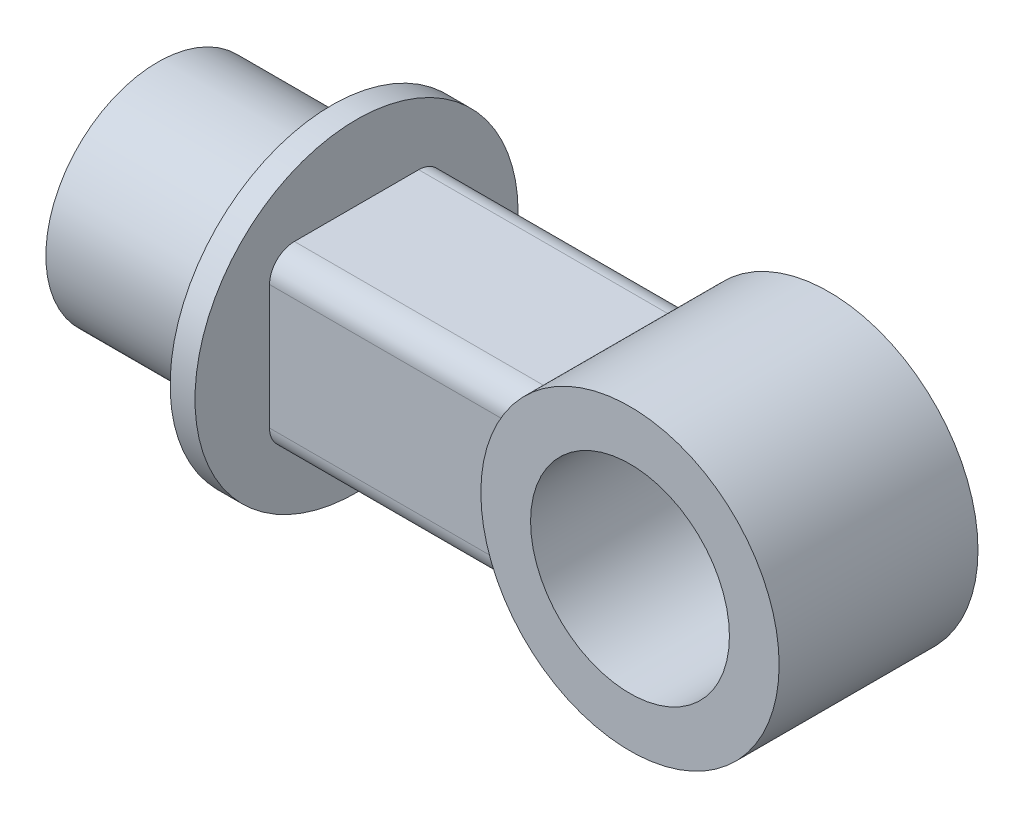
ISO-10303-21;
HEADER;
FILE_DESCRIPTION(('STEP AP214'),'2;1');
FILE_NAME('part.step','',(''),(''),'','','');
FILE_SCHEMA(('AUTOMOTIVE_DESIGN { 1 0 10303 214 1 1 1 1 }'));
ENDSEC;
DATA;
#1=APPLICATION_CONTEXT('core data for automotive mechanical design processes');
#2=APPLICATION_PROTOCOL_DEFINITION('international standard','automotive_design',2000,#1);
#3=PRODUCT_CONTEXT('',#1,'mechanical');
#4=PRODUCT('Part','Part','',(#3));
#5=PRODUCT_RELATED_PRODUCT_CATEGORY('part','',(#4));
#6=PRODUCT_DEFINITION_FORMATION('','',#4);
#7=PRODUCT_DEFINITION_CONTEXT('part definition',#1,'design');
#8=PRODUCT_DEFINITION('design','',#6,#7);
#9=PRODUCT_DEFINITION_SHAPE('','',#8);
#10=(LENGTH_UNIT() NAMED_UNIT(*) SI_UNIT(.MILLI.,.METRE.));
#11=(NAMED_UNIT(*) PLANE_ANGLE_UNIT() SI_UNIT($,.RADIAN.));
#12=(NAMED_UNIT(*) SI_UNIT($,.STERADIAN.) SOLID_ANGLE_UNIT());
#13=UNCERTAINTY_MEASURE_WITH_UNIT(LENGTH_MEASURE(1.E-05),#10,'distance_accuracy_value','');
#14=(GEOMETRIC_REPRESENTATION_CONTEXT(3) GLOBAL_UNCERTAINTY_ASSIGNED_CONTEXT((#13)) GLOBAL_UNIT_ASSIGNED_CONTEXT((#10,
#11,#12)) REPRESENTATION_CONTEXT('',''));
#15=CARTESIAN_POINT('',(0.,0.,0.));
#16=DIRECTION('',(0.,0.,1.));
#17=DIRECTION('',(1.,0.,0.));
#18=AXIS2_PLACEMENT_3D('',#15,#16,#17);
#19=CARTESIAN_POINT('',(190.,35.,35.));
#20=DIRECTION('',(0.,-1.,0.));
#21=DIRECTION('',(0.,0.,-1.));
#22=AXIS2_PLACEMENT_3D('',#19,#20,#21);
#23=PLANE('',#22);
#24=DIRECTION('',(0.,0.,1.));
#25=VECTOR('',#24,1.);
#26=CARTESIAN_POINT('',(80.,35.,35.));
#27=LINE('',#26,#25);
#28=CARTESIAN_POINT('',(80.,35.,-25.));
#29=VERTEX_POINT('',#28);
#30=CARTESIAN_POINT('',(80.,35.,25.));
#31=VERTEX_POINT('',#30);
#32=EDGE_CURVE('E208',#29,#31,#27,.T.);
#33=ORIENTED_EDGE('',*,*,#32,.T.);
#34=DIRECTION('',(-1.,0.,0.));
#35=VECTOR('',#34,1.);
#36=CARTESIAN_POINT('',(190.,35.,25.));
#37=LINE('',#36,#35);
#38=CARTESIAN_POINT('',(181.266028275955,35.,25.));
#39=VERTEX_POINT('',#38);
#40=EDGE_CURVE('E160',#31,#39,#37,.F.);
#41=ORIENTED_EDGE('',*,*,#40,.T.);
#42=DIRECTION('',(0.,0.,-1.));
#43=VECTOR('',#42,1.);
#44=CARTESIAN_POINT('',(181.266028275955,35.,40.));
#45=LINE('',#44,#43);
#46=CARTESIAN_POINT('',(181.266028275955,35.,-25.));
#47=VERTEX_POINT('',#46);
#48=EDGE_CURVE('E220',#47,#39,#45,.F.);
#49=ORIENTED_EDGE('',*,*,#48,.F.);
#50=DIRECTION('',(-1.,0.,0.));
#51=VECTOR('',#50,1.);
#52=CARTESIAN_POINT('',(190.,35.,-25.));
#53=LINE('',#52,#51);
#54=EDGE_CURVE('E157',#47,#29,#53,.T.);
#55=ORIENTED_EDGE('',*,*,#54,.T.);
#56=EDGE_LOOP('',(#33,#41,#49,#55));
#57=FACE_BOUND('',#56,.T.);
#58=ADVANCED_FACE('F39',(#57),#23,.F.);
#59=CARTESIAN_POINT('',(190.,-35.,35.));
#60=DIRECTION('',(0.,1.,0.));
#61=DIRECTION('',(0.,0.,1.));
#62=AXIS2_PLACEMENT_3D('',#59,#60,#61);
#63=PLANE('',#62);
#64=DIRECTION('',(0.,0.,-1.));
#65=VECTOR('',#64,1.);
#66=CARTESIAN_POINT('',(181.266028275955,-35.,40.));
#67=LINE('',#66,#65);
#68=CARTESIAN_POINT('',(181.266028275955,-35.,25.));
#69=VERTEX_POINT('',#68);
#70=CARTESIAN_POINT('',(181.266028275955,-35.,-25.));
#71=VERTEX_POINT('',#70);
#72=EDGE_CURVE('E115',#69,#71,#67,.T.);
#73=ORIENTED_EDGE('',*,*,#72,.F.);
#74=DIRECTION('',(-1.,0.,0.));
#75=VECTOR('',#74,1.);
#76=CARTESIAN_POINT('',(190.,-35.,25.));
#77=LINE('',#76,#75);
#78=CARTESIAN_POINT('',(80.,-35.,25.));
#79=VERTEX_POINT('',#78);
#80=EDGE_CURVE('E130',#69,#79,#77,.T.);
#81=ORIENTED_EDGE('',*,*,#80,.T.);
#82=DIRECTION('',(0.,0.,-1.));
#83=VECTOR('',#82,1.);
#84=CARTESIAN_POINT('',(80.,-35.,35.));
#85=LINE('',#84,#83);
#86=CARTESIAN_POINT('',(80.,-35.,-25.));
#87=VERTEX_POINT('',#86);
#88=EDGE_CURVE('E239',#79,#87,#85,.T.);
#89=ORIENTED_EDGE('',*,*,#88,.T.);
#90=DIRECTION('',(-1.,0.,0.));
#91=VECTOR('',#90,1.);
#92=CARTESIAN_POINT('',(190.,-35.,-25.));
#93=LINE('',#92,#91);
#94=EDGE_CURVE('E133',#87,#71,#93,.F.);
#95=ORIENTED_EDGE('',*,*,#94,.T.);
#96=EDGE_LOOP('',(#73,#81,#89,#95));
#97=FACE_BOUND('',#96,.T.);
#98=ADVANCED_FACE('F128',(#97),#63,.F.);
#99=CARTESIAN_POINT('',(70.,0.,0.));
#100=DIRECTION('',(-1.,0.,0.));
#101=DIRECTION('',(0.,0.,1.));
#102=AXIS2_PLACEMENT_3D('',#99,#100,#101);
#103=CYLINDRICAL_SURFACE('',#102,45.);
#104=CARTESIAN_POINT('',(70.,0.,0.));
#105=DIRECTION('',(1.,0.,0.));
#106=DIRECTION('',(0.,0.,-1.));
#107=AXIS2_PLACEMENT_3D('',#104,#105,#106);
#108=CIRCLE('',#107,45.);
#109=CARTESIAN_POINT('',(70.,0.,-45.));
#110=VERTEX_POINT('',#109);
#111=EDGE_CURVE('E135',#110,#110,#108,.T.);
#112=ORIENTED_EDGE('',*,*,#111,.F.);
#113=EDGE_LOOP('',(#112));
#114=FACE_BOUND('',#113,.T.);
#115=CARTESIAN_POINT('',(0.,0.,0.));
#116=DIRECTION('',(1.,0.,0.));
#117=DIRECTION('',(0.,0.,-1.));
#118=AXIS2_PLACEMENT_3D('',#115,#116,#117);
#119=CIRCLE('',#118,45.);
#120=CARTESIAN_POINT('',(0.,0.,-45.));
#121=VERTEX_POINT('',#120);
#122=EDGE_CURVE('E247',#121,#121,#119,.T.);
#123=ORIENTED_EDGE('',*,*,#122,.T.);
#124=EDGE_LOOP('',(#123));
#125=FACE_BOUND('',#124,.T.);
#126=ADVANCED_FACE('F180',(#114,#125),#103,.T.);
#127=CARTESIAN_POINT('',(0.,0.,0.));
#128=DIRECTION('',(1.,0.,0.));
#129=DIRECTION('',(0.,0.,-1.));
#130=AXIS2_PLACEMENT_3D('',#127,#128,#129);
#131=PLANE('',#130);
#132=ORIENTED_EDGE('',*,*,#122,.F.);
#133=EDGE_LOOP('',(#132));
#134=FACE_BOUND('',#133,.T.);
#135=ADVANCED_FACE('F259',(#134),#131,.F.);
#136=CARTESIAN_POINT('',(80.,0.,0.));
#137=DIRECTION('',(-1.,0.,0.));
#138=DIRECTION('',(0.,0.,1.));
#139=AXIS2_PLACEMENT_3D('',#136,#137,#138);
#140=CYLINDRICAL_SURFACE('',#139,65.);
#141=CARTESIAN_POINT('',(80.,0.,0.));
#142=DIRECTION('',(1.,0.,0.));
#143=DIRECTION('',(0.,0.,-1.));
#144=AXIS2_PLACEMENT_3D('',#141,#142,#143);
#145=CIRCLE('',#144,65.);
#146=CARTESIAN_POINT('',(80.,0.,-65.));
#147=VERTEX_POINT('',#146);
#148=EDGE_CURVE('E243',#147,#147,#145,.T.);
#149=ORIENTED_EDGE('',*,*,#148,.F.);
#150=EDGE_LOOP('',(#149));
#151=FACE_BOUND('',#150,.T.);
#152=CARTESIAN_POINT('',(70.,0.,0.));
#153=DIRECTION('',(1.,0.,0.));
#154=DIRECTION('',(0.,0.,-1.));
#155=AXIS2_PLACEMENT_3D('',#152,#153,#154);
#156=CIRCLE('',#155,65.);
#157=CARTESIAN_POINT('',(70.,0.,-65.));
#158=VERTEX_POINT('',#157);
#159=EDGE_CURVE('E242',#158,#158,#156,.T.);
#160=ORIENTED_EDGE('',*,*,#159,.T.);
#161=EDGE_LOOP('',(#160));
#162=FACE_BOUND('',#161,.T.);
#163=ADVANCED_FACE('F261',(#151,#162),#140,.T.);
#164=CARTESIAN_POINT('',(80.,0.,0.));
#165=DIRECTION('',(1.,0.,0.));
#166=DIRECTION('',(0.,0.,-1.));
#167=AXIS2_PLACEMENT_3D('',#164,#165,#166);
#168=PLANE('',#167);
#169=DIRECTION('',(0.,1.,0.));
#170=VECTOR('',#169,1.);
#171=CARTESIAN_POINT('',(80.,35.,-35.));
#172=LINE('',#171,#170);
#173=CARTESIAN_POINT('',(80.,-25.,-35.));
#174=VERTEX_POINT('',#173);
#175=CARTESIAN_POINT('',(80.,25.,-35.));
#176=VERTEX_POINT('',#175);
#177=EDGE_CURVE('E207',#174,#176,#172,.T.);
#178=ORIENTED_EDGE('',*,*,#177,.F.);
#179=CARTESIAN_POINT('',(80.,-25.,-25.));
#180=DIRECTION('',(1.,0.,0.));
#181=DIRECTION('',(0.,0.,-1.));
#182=AXIS2_PLACEMENT_3D('',#179,#180,#181);
#183=CIRCLE('',#182,10.);
#184=EDGE_CURVE('E123',#174,#87,#183,.F.);
#185=ORIENTED_EDGE('',*,*,#184,.T.);
#186=ORIENTED_EDGE('',*,*,#88,.F.);
#187=CARTESIAN_POINT('',(80.,-25.,25.));
#188=DIRECTION('',(1.,0.,0.));
#189=DIRECTION('',(0.,0.,-1.));
#190=AXIS2_PLACEMENT_3D('',#187,#188,#189);
#191=CIRCLE('',#190,10.);
#192=CARTESIAN_POINT('',(80.,-25.,35.));
#193=VERTEX_POINT('',#192);
#194=EDGE_CURVE('E124',#79,#193,#191,.F.);
#195=ORIENTED_EDGE('',*,*,#194,.T.);
#196=DIRECTION('',(0.,-1.,0.));
#197=VECTOR('',#196,1.);
#198=CARTESIAN_POINT('',(80.,35.,35.));
#199=LINE('',#198,#197);
#200=CARTESIAN_POINT('',(80.,25.,35.));
#201=VERTEX_POINT('',#200);
#202=EDGE_CURVE('E235',#201,#193,#199,.T.);
#203=ORIENTED_EDGE('',*,*,#202,.F.);
#204=CARTESIAN_POINT('',(80.,25.,25.));
#205=DIRECTION('',(1.,0.,0.));
#206=DIRECTION('',(0.,0.,-1.));
#207=AXIS2_PLACEMENT_3D('',#204,#205,#206);
#208=CIRCLE('',#207,10.);
#209=EDGE_CURVE('E61',#201,#31,#208,.F.);
#210=ORIENTED_EDGE('',*,*,#209,.T.);
#211=ORIENTED_EDGE('',*,*,#32,.F.);
#212=CARTESIAN_POINT('',(80.,25.,-25.));
#213=DIRECTION('',(1.,0.,0.));
#214=DIRECTION('',(0.,0.,-1.));
#215=AXIS2_PLACEMENT_3D('',#212,#213,#214);
#216=CIRCLE('',#215,10.);
#217=EDGE_CURVE('E54',#29,#176,#216,.F.);
#218=ORIENTED_EDGE('',*,*,#217,.T.);
#219=EDGE_LOOP('',(#178,#185,#186,#195,#203,#210,#211,#218));
#220=FACE_BOUND('',#219,.T.);
#221=ORIENTED_EDGE('',*,*,#148,.T.);
#222=EDGE_LOOP('',(#221));
#223=FACE_BOUND('',#222,.T.);
#224=ADVANCED_FACE('F205',(#220,#223),#168,.T.);
#225=CARTESIAN_POINT('',(70.,0.,0.));
#226=DIRECTION('',(1.,0.,0.));
#227=DIRECTION('',(0.,0.,-1.));
#228=AXIS2_PLACEMENT_3D('',#225,#226,#227);
#229=PLANE('',#228);
#230=ORIENTED_EDGE('',*,*,#111,.T.);
#231=EDGE_LOOP('',(#230));
#232=FACE_BOUND('',#231,.T.);
#233=ORIENTED_EDGE('',*,*,#159,.F.);
#234=EDGE_LOOP('',(#233));
#235=FACE_BOUND('',#234,.T.);
#236=ADVANCED_FACE('F279',(#232,#235),#229,.F.);
#237=CARTESIAN_POINT('',(190.,35.,-35.));
#238=DIRECTION('',(0.,0.,1.));
#239=DIRECTION('',(0.,-1.,0.));
#240=AXIS2_PLACEMENT_3D('',#237,#238,#239);
#241=PLANE('',#240);
#242=CARTESIAN_POINT('',(230.,0.,-35.));
#243=DIRECTION('',(0.,0.,1.));
#244=DIRECTION('',(0.,-1.,0.));
#245=AXIS2_PLACEMENT_3D('',#242,#243,#244);
#246=CIRCLE('',#245,60.);
#247=CARTESIAN_POINT('',(175.456439426821,-25.,-35.));
#248=VERTEX_POINT('',#247);
#249=CARTESIAN_POINT('',(175.456439426821,25.,-35.));
#250=VERTEX_POINT('',#249);
#251=EDGE_CURVE('E215',#248,#250,#246,.F.);
#252=ORIENTED_EDGE('',*,*,#251,.F.);
#253=DIRECTION('',(-1.,0.,0.));
#254=VECTOR('',#253,1.);
#255=CARTESIAN_POINT('',(190.,-25.,-35.));
#256=LINE('',#255,#254);
#257=EDGE_CURVE('E153',#248,#174,#256,.T.);
#258=ORIENTED_EDGE('',*,*,#257,.T.);
#259=ORIENTED_EDGE('',*,*,#177,.T.);
#260=DIRECTION('',(-1.,0.,0.));
#261=VECTOR('',#260,1.);
#262=CARTESIAN_POINT('',(190.,25.,-35.));
#263=LINE('',#262,#261);
#264=EDGE_CURVE('E150',#176,#250,#263,.F.);
#265=ORIENTED_EDGE('',*,*,#264,.T.);
#266=EDGE_LOOP('',(#252,#258,#259,#265));
#267=FACE_BOUND('',#266,.T.);
#268=ADVANCED_FACE('F211',(#267),#241,.F.);
#269=CARTESIAN_POINT('',(190.,35.,35.));
#270=DIRECTION('',(0.,0.,-1.));
#271=DIRECTION('',(0.,1.,0.));
#272=AXIS2_PLACEMENT_3D('',#269,#270,#271);
#273=PLANE('',#272);
#274=ORIENTED_EDGE('',*,*,#202,.T.);
#275=DIRECTION('',(-1.,0.,0.));
#276=VECTOR('',#275,1.);
#277=CARTESIAN_POINT('',(190.,-25.,35.));
#278=LINE('',#277,#276);
#279=CARTESIAN_POINT('',(175.456439426821,-25.,35.));
#280=VERTEX_POINT('',#279);
#281=EDGE_CURVE('E144',#193,#280,#278,.F.);
#282=ORIENTED_EDGE('',*,*,#281,.T.);
#283=CARTESIAN_POINT('',(230.,0.,35.));
#284=DIRECTION('',(0.,0.,-1.));
#285=DIRECTION('',(0.,1.,0.));
#286=AXIS2_PLACEMENT_3D('',#283,#284,#285);
#287=CIRCLE('',#286,60.);
#288=CARTESIAN_POINT('',(175.456439426821,25.,35.));
#289=VERTEX_POINT('',#288);
#290=EDGE_CURVE('E118',#289,#280,#287,.F.);
#291=ORIENTED_EDGE('',*,*,#290,.F.);
#292=DIRECTION('',(-1.,0.,0.));
#293=VECTOR('',#292,1.);
#294=CARTESIAN_POINT('',(190.,25.,35.));
#295=LINE('',#294,#293);
#296=EDGE_CURVE('E139',#289,#201,#295,.T.);
#297=ORIENTED_EDGE('',*,*,#296,.T.);
#298=EDGE_LOOP('',(#274,#282,#291,#297));
#299=FACE_BOUND('',#298,.T.);
#300=ADVANCED_FACE('F276',(#299),#273,.F.);
#301=CARTESIAN_POINT('',(230.,0.,40.));
#302=DIRECTION('',(0.,0.,-1.));
#303=DIRECTION('',(-1.,0.,0.));
#304=AXIS2_PLACEMENT_3D('',#301,#302,#303);
#305=CYLINDRICAL_SURFACE('',#304,60.);
#306=CARTESIAN_POINT('',(230.,0.,40.));
#307=DIRECTION('',(0.,0.,1.));
#308=DIRECTION('',(1.,0.,0.));
#309=AXIS2_PLACEMENT_3D('',#306,#307,#308);
#310=CIRCLE('',#309,60.);
#311=CARTESIAN_POINT('',(290.,0.,40.));
#312=VERTEX_POINT('',#311);
#313=EDGE_CURVE('E229',#312,#312,#310,.T.);
#314=ORIENTED_EDGE('',*,*,#313,.F.);
#315=EDGE_LOOP('',(#314));
#316=FACE_BOUND('',#315,.T.);
#317=CARTESIAN_POINT('',(230.,0.,-40.));
#318=DIRECTION('',(0.,0.,1.));
#319=DIRECTION('',(1.,0.,0.));
#320=AXIS2_PLACEMENT_3D('',#317,#318,#319);
#321=CIRCLE('',#320,60.);
#322=CARTESIAN_POINT('',(290.,0.,-40.));
#323=VERTEX_POINT('',#322);
#324=EDGE_CURVE('E416',#323,#323,#321,.T.);
#325=ORIENTED_EDGE('',*,*,#324,.T.);
#326=EDGE_LOOP('',(#325));
#327=FACE_BOUND('',#326,.T.);
#328=ORIENTED_EDGE('',*,*,#290,.T.);
#329=CARTESIAN_POINT('',(175.456439426821,-25.,35.));
#330=CARTESIAN_POINT('',(175.601061526117,-25.3155991065036,35.0000090511382));
#331=CARTESIAN_POINT('',(175.748450332835,-25.629864034902,34.9850616795839));
#332=CARTESIAN_POINT('',(176.047493333127,-26.2534877597754,34.9260655132162));
#333=CARTESIAN_POINT('',(176.199146216606,-26.562848018451,34.8820255652564));
#334=CARTESIAN_POINT('',(176.505451125839,-27.1744441377415,34.765687974456));
#335=CARTESIAN_POINT('',(176.660101386641,-27.4766839719201,34.693406507861));
#336=CARTESIAN_POINT('',(176.971170488185,-28.0723365147055,34.5213891362094));
#337=CARTESIAN_POINT('',(177.127589466323,-28.3657485309889,34.4216510840581));
#338=CARTESIAN_POINT('',(177.440590162976,-28.9415917789264,34.1956198679678));
#339=CARTESIAN_POINT('',(177.597171505048,-29.224034899946,34.0693564643794));
#340=CARTESIAN_POINT('',(177.909212403687,-29.776678622792,33.7908550714645));
#341=CARTESIAN_POINT('',(178.064671391129,-30.0468733363622,33.63860475341));
#342=CARTESIAN_POINT('',(178.372836360805,-30.5733394596567,33.308698283693));
#343=CARTESIAN_POINT('',(178.525540026143,-30.8295994861049,33.1310217791304));
#344=CARTESIAN_POINT('',(178.826189486237,-31.326112768696,32.7510013785089));
#345=CARTESIAN_POINT('',(178.974135669068,-31.5663673321506,32.5486595009252));
#346=CARTESIAN_POINT('',(179.263726350808,-32.0297589233253,32.1191744265901));
#347=CARTESIAN_POINT('',(179.405346161308,-32.2528309968607,31.8919442982872));
#348=CARTESIAN_POINT('',(179.679375236152,-32.6787217689519,31.4140217320224));
#349=CARTESIAN_POINT('',(179.811783431937,-32.8815381190034,31.1633265799734));
#350=CARTESIAN_POINT('',(180.064517587092,-33.2640959208239,30.6399992982887));
#351=CARTESIAN_POINT('',(180.184864739542,-33.4438780078098,30.3674072196752));
#352=CARTESIAN_POINT('',(180.410851472929,-33.7780556499717,29.8014177464231));
#353=CARTESIAN_POINT('',(180.516498298321,-33.9324637165358,29.5080307081002));
#354=CARTESIAN_POINT('',(180.681454904399,-34.1715602463413,28.9922060930077));
#355=CARTESIAN_POINT('',(180.745226291692,-34.2633600307225,28.7744589611579));
#356=CARTESIAN_POINT('',(180.862971356292,-34.4320053874195,28.3307019728428));
#357=CARTESIAN_POINT('',(180.916947396447,-34.5088545664653,28.1046941248852));
#358=CARTESIAN_POINT('',(181.014037820426,-34.6465381331945,27.6460389357039));
#359=CARTESIAN_POINT('',(181.057172255993,-34.7074020953365,27.4134047509545));
#360=CARTESIAN_POINT('',(181.131837554428,-34.8124526093141,26.9426568091129));
#361=CARTESIAN_POINT('',(181.163372620025,-34.8566452017346,26.7045450699614));
#362=CARTESIAN_POINT('',(181.214326584174,-34.9279260703106,26.2230377430851));
#363=CARTESIAN_POINT('',(181.233675174265,-34.9549151030918,25.9796197280848));
#364=CARTESIAN_POINT('',(181.253064920415,-34.9819442820206,25.6130486012916));
#365=CARTESIAN_POINT('',(181.257922652319,-34.9887116192577,25.4905969172243));
#366=CARTESIAN_POINT('',(181.264405216411,-34.9977401830071,25.2454359324713));
#367=CARTESIAN_POINT('',(181.26602988271,-35.0000011782983,25.1227266188901));
#368=CARTESIAN_POINT('',(181.266028275955,-35.,25.));
#369=B_SPLINE_CURVE_WITH_KNOTS('',3,(#329,#330,#331,#332,#333,#334,#335,#336,#337,#338,#339,
#340,#341,#342,#343,#344,#345,#346,#347,#348,#349,#350,#351,#352,#353,#354,#355,#356,#357,#358,
#359,#360,#361,#362,#363,#364,#365,#366,#367,#368),.UNSPECIFIED.,.F.,.F.,(4,2,2,2,2,2,2,2,2,2,2,
2,2,2,2,2,2,2,2,4),(0.,1.04105172216457,2.08178701325635,3.12192706130018,4.16214847102126,
5.2012089693103,6.24076379648854,7.28115545976241,8.32146204032926,9.36552572014162,
10.4097103113845,11.4520267002638,12.4938275929719,13.2273965642913,13.9607883471262,
14.6928135586395,15.4245732780382,16.1605170330434,16.5286121996862,16.8967262528629),.UNSPECIFIED.);
#370=EDGE_CURVE('E112',#280,#69,#369,.T.);
#371=ORIENTED_EDGE('',*,*,#370,.T.);
#372=ORIENTED_EDGE('',*,*,#72,.T.);
#373=CARTESIAN_POINT('',(181.266028275955,-35.,-25.));
#374=CARTESIAN_POINT('',(181.266029927435,-35.0000012089447,-25.1236077246188));
#375=CARTESIAN_POINT('',(181.264381819695,-34.9977076087041,-25.2471977622572));
#376=CARTESIAN_POINT('',(181.257805948104,-34.988549059488,-25.4941148527889));
#377=CARTESIAN_POINT('',(181.252878348718,-34.9816843397497,-25.617441918559));
#378=CARTESIAN_POINT('',(181.233216615956,-34.954275558687,-25.9865038799276));
#379=CARTESIAN_POINT('',(181.213603481385,-34.9269168117864,-26.2315231126617));
#380=CARTESIAN_POINT('',(181.161979586533,-34.8546940825433,-26.7159965854491));
#381=CARTESIAN_POINT('',(181.130047614671,-34.8099413348512,-26.9554761415004));
#382=CARTESIAN_POINT('',(181.054472198846,-34.7035957353012,-27.4287992846889));
#383=CARTESIAN_POINT('',(181.010827581399,-34.6420011960602,-27.6626423045444));
#384=CARTESIAN_POINT('',(180.912823676326,-34.5029900721394,-28.122624293057));
#385=CARTESIAN_POINT('',(180.858489776197,-34.4256109607243,-28.34878005487));
#386=CARTESIAN_POINT('',(180.740010477205,-34.2558628704691,-28.7928258925261));
#387=CARTESIAN_POINT('',(180.675861258678,-34.1634880551426,-29.0107127091052));
#388=CARTESIAN_POINT('',(180.538744872275,-33.9646702799393,-29.4373566230007));
#389=CARTESIAN_POINT('',(180.465768946329,-33.8582133374718,-29.6461043680114));
#390=CARTESIAN_POINT('',(180.312081550045,-33.6322678275648,-30.0535383384957));
#391=CARTESIAN_POINT('',(180.231367085592,-33.5127742136243,-30.252220623734));
#392=CARTESIAN_POINT('',(180.056252237232,-33.2512976476657,-30.6549448739337));
#393=CARTESIAN_POINT('',(179.961271914853,-33.1082707983315,-30.8580579914951));
#394=CARTESIAN_POINT('',(179.764701941196,-32.8092510070103,-31.2511327175128));
#395=CARTESIAN_POINT('',(179.663109925093,-32.6532534201394,-31.4410895696234));
#396=CARTESIAN_POINT('',(179.350143160138,-32.1673711435317,-31.9905360438146));
#397=CARTESIAN_POINT('',(179.130486074031,-31.8194614683198,-32.3298079912793));
#398=CARTESIAN_POINT('',(178.771018462703,-31.2354998015134,-32.8229762804426));
#399=CARTESIAN_POINT('',(178.63550797676,-31.0122647850901,-32.9957404349853));
#400=CARTESIAN_POINT('',(178.361183849557,-30.5532978717328,-33.3210533804698));
#401=CARTESIAN_POINT('',(178.222369884124,-30.3175647455323,-33.473600177726));
#402=CARTESIAN_POINT('',(177.942768001831,-29.8349199063672,-33.7579712951663));
#403=CARTESIAN_POINT('',(177.801979375679,-29.5880041017377,-33.889787950136));
#404=CARTESIAN_POINT('',(177.519675743339,-29.0843412832742,-34.1321549396589));
#405=CARTESIAN_POINT('',(177.378160723162,-28.8275940794877,-34.2427048630685));
#406=CARTESIAN_POINT('',(177.084223501821,-28.2846831672995,-34.4499677676515));
#407=CARTESIAN_POINT('',(176.931833423497,-27.997808328808,-34.5448689590494));
#408=CARTESIAN_POINT('',(176.628823591511,-27.4157844524159,-34.7085206958334));
#409=CARTESIAN_POINT('',(176.478203836996,-27.1206354185024,-34.7772712538196));
#410=CARTESIAN_POINT('',(176.179908875788,-26.5237420452477,-34.887888620785));
#411=CARTESIAN_POINT('',(176.032234605995,-26.2219956694326,-34.9297470039673));
#412=CARTESIAN_POINT('',(175.74097705303,-25.6139212779544,-34.9858099556644));
#413=CARTESIAN_POINT('',(175.597394661039,-25.3075922860517,-35.0000085447518));
#414=CARTESIAN_POINT('',(175.456439426821,-25.,-35.));
#415=B_SPLINE_CURVE_WITH_KNOTS('',3,(#373,#374,#375,#376,#377,#378,#379,#380,#381,#382,#383,
#384,#385,#386,#387,#388,#389,#390,#391,#392,#393,#394,#395,#396,#397,#398,#399,#400,#401,#402,
#403,#404,#405,#406,#407,#408,#409,#410,#411,#412,#413,#414),.UNSPECIFIED.,.F.,.F.,(4,2,2,2,2,2,
2,2,2,2,2,2,2,2,2,2,2,2,2,2,4),(0.,0.370755935170314,0.741493278689136,1.48235953485107,
2.21856390372783,2.95484206013978,3.6893921883474,4.42422889970989,5.15980080880702,
5.89565847523182,6.69272478852507,7.49007777470172,9.0840007592284,10.0226270796249,
10.9613458916185,11.9004109939608,12.8394942491485,13.853624155099,14.8677535724044,
15.8822005797329,16.8968668634305),.UNSPECIFIED.);
#416=EDGE_CURVE('E187',#71,#248,#415,.T.);
#417=ORIENTED_EDGE('',*,*,#416,.T.);
#418=ORIENTED_EDGE('',*,*,#251,.T.);
#419=CARTESIAN_POINT('',(175.456439426821,25.,-35.));
#420=CARTESIAN_POINT('',(175.601061526117,25.3155991065036,-35.0000090511382));
#421=CARTESIAN_POINT('',(175.748450332835,25.629864034902,-34.9850616795839));
#422=CARTESIAN_POINT('',(176.047493333127,26.2534877597754,-34.9260655132162));
#423=CARTESIAN_POINT('',(176.199146216606,26.562848018451,-34.8820255652564));
#424=CARTESIAN_POINT('',(176.505451125839,27.1744441377415,-34.765687974456));
#425=CARTESIAN_POINT('',(176.660101386641,27.4766839719201,-34.693406507861));
#426=CARTESIAN_POINT('',(176.971170488185,28.0723365147055,-34.5213891362094));
#427=CARTESIAN_POINT('',(177.127589466323,28.3657485309889,-34.4216510840581));
#428=CARTESIAN_POINT('',(177.440590162976,28.9415917789264,-34.1956198679678));
#429=CARTESIAN_POINT('',(177.597171505048,29.224034899946,-34.0693564643794));
#430=CARTESIAN_POINT('',(177.909212403687,29.776678622792,-33.7908550714645));
#431=CARTESIAN_POINT('',(178.064671391129,30.0468733363622,-33.63860475341));
#432=CARTESIAN_POINT('',(178.372836360805,30.5733394596567,-33.308698283693));
#433=CARTESIAN_POINT('',(178.525540026143,30.8295994861049,-33.1310217791304));
#434=CARTESIAN_POINT('',(178.826189486237,31.326112768696,-32.7510013785089));
#435=CARTESIAN_POINT('',(178.974135669068,31.5663673321506,-32.5486595009252));
#436=CARTESIAN_POINT('',(179.263726350808,32.0297589233253,-32.1191744265901));
#437=CARTESIAN_POINT('',(179.405346161308,32.2528309968607,-31.8919442982872));
#438=CARTESIAN_POINT('',(179.679375236152,32.6787217689519,-31.4140217320224));
#439=CARTESIAN_POINT('',(179.811783431937,32.8815381190034,-31.1633265799734));
#440=CARTESIAN_POINT('',(180.064517587092,33.2640959208239,-30.6399992982887));
#441=CARTESIAN_POINT('',(180.184864739542,33.4438780078098,-30.3674072196752));
#442=CARTESIAN_POINT('',(180.410851472929,33.7780556499717,-29.8014177464231));
#443=CARTESIAN_POINT('',(180.516498298321,33.9324637165358,-29.5080307081002));
#444=CARTESIAN_POINT('',(180.681454904399,34.1715602463412,-28.9922060930077));
#445=CARTESIAN_POINT('',(180.745226291692,34.2633600307225,-28.7744589611579));
#446=CARTESIAN_POINT('',(180.862971356292,34.4320053874195,-28.3307019728428));
#447=CARTESIAN_POINT('',(180.916947396447,34.5088545664653,-28.1046941248852));
#448=CARTESIAN_POINT('',(181.014037820426,34.6465381331945,-27.6460389357039));
#449=CARTESIAN_POINT('',(181.057172255993,34.7074020953365,-27.4134047509545));
#450=CARTESIAN_POINT('',(181.131837554428,34.8124526093141,-26.9426568091129));
#451=CARTESIAN_POINT('',(181.163372620025,34.8566452017346,-26.7045450699614));
#452=CARTESIAN_POINT('',(181.214326584174,34.9279260703106,-26.2230377430851));
#453=CARTESIAN_POINT('',(181.233675174265,34.9549151030918,-25.9796197280848));
#454=CARTESIAN_POINT('',(181.253064920415,34.9819442820206,-25.6130486012916));
#455=CARTESIAN_POINT('',(181.257922652319,34.9887116192577,-25.4905969172243));
#456=CARTESIAN_POINT('',(181.264405216411,34.9977401830071,-25.2454359324713));
#457=CARTESIAN_POINT('',(181.26602988271,35.0000011782983,-25.1227266188901));
#458=CARTESIAN_POINT('',(181.266028275955,35.,-25.));
#459=B_SPLINE_CURVE_WITH_KNOTS('',3,(#419,#420,#421,#422,#423,#424,#425,#426,#427,#428,#429,
#430,#431,#432,#433,#434,#435,#436,#437,#438,#439,#440,#441,#442,#443,#444,#445,#446,#447,#448,
#449,#450,#451,#452,#453,#454,#455,#456,#457,#458),.UNSPECIFIED.,.F.,.F.,(4,2,2,2,2,2,2,2,2,2,2,
2,2,2,2,2,2,2,2,4),(0.,1.04105172216457,2.08178701325635,3.12192706130018,4.16214847102126,
5.2012089693103,6.24076379648853,7.28115545976241,8.32146204032926,9.36552572014163,
10.4097103113844,11.4520267002638,12.4938275929718,13.2273965642913,13.9607883471262,
14.6928135586395,15.4245732780382,16.1605170330434,16.5286121996862,16.8967262528629),.UNSPECIFIED.);
#460=EDGE_CURVE('E11',#250,#47,#459,.T.);
#461=ORIENTED_EDGE('',*,*,#460,.T.);
#462=ORIENTED_EDGE('',*,*,#48,.T.);
#463=CARTESIAN_POINT('',(181.266028275955,35.,25.));
#464=CARTESIAN_POINT('',(181.266029927435,35.0000012089447,25.1236077246188));
#465=CARTESIAN_POINT('',(181.264381819695,34.9977076087041,25.2471977622572));
#466=CARTESIAN_POINT('',(181.257805948104,34.988549059488,25.4941148527889));
#467=CARTESIAN_POINT('',(181.252878348718,34.9816843397497,25.6174419185589));
#468=CARTESIAN_POINT('',(181.233216615956,34.954275558687,25.9865038799276));
#469=CARTESIAN_POINT('',(181.213603481385,34.9269168117864,26.2315231126617));
#470=CARTESIAN_POINT('',(181.161979586533,34.8546940825433,26.7159965854491));
#471=CARTESIAN_POINT('',(181.130047614671,34.8099413348512,26.9554761415003));
#472=CARTESIAN_POINT('',(181.054472198846,34.7035957353012,27.4287992846889));
#473=CARTESIAN_POINT('',(181.010827581399,34.6420011960602,27.6626423045444));
#474=CARTESIAN_POINT('',(180.912823676326,34.5029900721394,28.122624293057));
#475=CARTESIAN_POINT('',(180.858489776197,34.4256109607243,28.3487800548699));
#476=CARTESIAN_POINT('',(180.740010477205,34.2558628704691,28.7928258925261));
#477=CARTESIAN_POINT('',(180.675861258678,34.1634880551426,29.0107127091052));
#478=CARTESIAN_POINT('',(180.538744872275,33.9646702799393,29.4373566230007));
#479=CARTESIAN_POINT('',(180.465768946329,33.8582133374718,29.6461043680114));
#480=CARTESIAN_POINT('',(180.312081550045,33.6322678275648,30.0535383384957));
#481=CARTESIAN_POINT('',(180.231367085592,33.5127742136243,30.252220623734));
#482=CARTESIAN_POINT('',(180.056252237232,33.2512976476657,30.6549448739337));
#483=CARTESIAN_POINT('',(179.961271914853,33.1082707983315,30.8580579914951));
#484=CARTESIAN_POINT('',(179.764701941196,32.8092510070103,31.2511327175128));
#485=CARTESIAN_POINT('',(179.663109925093,32.6532534201394,31.4410895696234));
#486=CARTESIAN_POINT('',(179.350143160138,32.1673711435316,31.9905360438146));
#487=CARTESIAN_POINT('',(179.130486074031,31.8194614683198,32.3298079912793));
#488=CARTESIAN_POINT('',(178.771018462703,31.2354998015134,32.8229762804426));
#489=CARTESIAN_POINT('',(178.63550797676,31.0122647850901,32.9957404349853));
#490=CARTESIAN_POINT('',(178.361183849557,30.5532978717328,33.3210533804698));
#491=CARTESIAN_POINT('',(178.222369884124,30.3175647455323,33.4736001777259));
#492=CARTESIAN_POINT('',(177.942768001831,29.8349199063672,33.7579712951663));
#493=CARTESIAN_POINT('',(177.801979375679,29.5880041017377,33.889787950136));
#494=CARTESIAN_POINT('',(177.519675743338,29.0843412832742,34.1321549396589));
#495=CARTESIAN_POINT('',(177.378160723162,28.8275940794877,34.2427048630685));
#496=CARTESIAN_POINT('',(177.084223501821,28.2846831672995,34.4499677676514));
#497=CARTESIAN_POINT('',(176.931833423497,27.997808328808,34.5448689590494));
#498=CARTESIAN_POINT('',(176.628823591511,27.4157844524159,34.7085206958333));
#499=CARTESIAN_POINT('',(176.478203836996,27.1206354185024,34.7772712538196));
#500=CARTESIAN_POINT('',(176.179908875788,26.5237420452477,34.8878886207849));
#501=CARTESIAN_POINT('',(176.032234605995,26.2219956694326,34.9297470039673));
#502=CARTESIAN_POINT('',(175.74097705303,25.6139212779544,34.9858099556644));
#503=CARTESIAN_POINT('',(175.597394661039,25.3075922860517,35.0000085447518));
#504=CARTESIAN_POINT('',(175.456439426821,25.,35.));
#505=B_SPLINE_CURVE_WITH_KNOTS('',3,(#463,#464,#465,#466,#467,#468,#469,#470,#471,#472,#473,
#474,#475,#476,#477,#478,#479,#480,#481,#482,#483,#484,#485,#486,#487,#488,#489,#490,#491,#492,
#493,#494,#495,#496,#497,#498,#499,#500,#501,#502,#503,#504),.UNSPECIFIED.,.F.,.F.,(4,2,2,2,2,2,
2,2,2,2,2,2,2,2,2,2,2,2,2,2,4),(0.,0.37075593517031,0.741493278689133,1.48235953485107,
2.21856390372782,2.95484206013978,3.6893921883474,4.42422889970989,5.15980080880702,
5.89565847523182,6.69272478852507,7.49007777470173,9.08400075922841,10.0226270796249,
10.9613458916185,11.9004109939608,12.8394942491485,13.853624155099,14.8677535724044,
15.8822005797329,16.8968668634304),.UNSPECIFIED.);
#506=EDGE_CURVE('E196',#39,#289,#505,.T.);
#507=ORIENTED_EDGE('',*,*,#506,.T.);
#508=EDGE_LOOP('',(#328,#371,#372,#417,#418,#461,#462,#507));
#509=FACE_BOUND('',#508,.T.);
#510=ADVANCED_FACE('F114',(#316,#327,#509),#305,.T.);
#511=CARTESIAN_POINT('',(230.,0.,40.));
#512=DIRECTION('',(0.,0.,1.));
#513=DIRECTION('',(1.,0.,0.));
#514=AXIS2_PLACEMENT_3D('',#511,#512,#513);
#515=PLANE('',#514);
#516=ORIENTED_EDGE('',*,*,#313,.T.);
#517=EDGE_LOOP('',(#516));
#518=FACE_BOUND('',#517,.T.);
#519=CARTESIAN_POINT('',(230.,0.,40.));
#520=DIRECTION('',(0.,0.,1.));
#521=DIRECTION('',(1.,0.,0.));
#522=AXIS2_PLACEMENT_3D('',#519,#520,#521);
#523=CIRCLE('',#522,40.);
#524=CARTESIAN_POINT('',(270.,0.,40.));
#525=VERTEX_POINT('',#524);
#526=EDGE_CURVE('E408',#525,#525,#523,.T.);
#527=ORIENTED_EDGE('',*,*,#526,.F.);
#528=EDGE_LOOP('',(#527));
#529=FACE_BOUND('',#528,.T.);
#530=ADVANCED_FACE('F310',(#518,#529),#515,.T.);
#531=CARTESIAN_POINT('',(230.,0.,-40.));
#532=DIRECTION('',(0.,0.,1.));
#533=DIRECTION('',(1.,0.,0.));
#534=AXIS2_PLACEMENT_3D('',#531,#532,#533);
#535=PLANE('',#534);
#536=ORIENTED_EDGE('',*,*,#324,.F.);
#537=EDGE_LOOP('',(#536));
#538=FACE_BOUND('',#537,.T.);
#539=CARTESIAN_POINT('',(230.,0.,-40.));
#540=DIRECTION('',(0.,0.,1.));
#541=DIRECTION('',(1.,0.,0.));
#542=AXIS2_PLACEMENT_3D('',#539,#540,#541);
#543=CIRCLE('',#542,40.);
#544=CARTESIAN_POINT('',(270.,0.,-40.));
#545=VERTEX_POINT('',#544);
#546=EDGE_CURVE('E411',#545,#545,#543,.T.);
#547=ORIENTED_EDGE('',*,*,#546,.T.);
#548=EDGE_LOOP('',(#547));
#549=FACE_BOUND('',#548,.T.);
#550=ADVANCED_FACE('F317',(#538,#549),#535,.F.);
#551=CARTESIAN_POINT('',(230.,0.,40.));
#552=DIRECTION('',(0.,0.,-1.));
#553=DIRECTION('',(-1.,0.,0.));
#554=AXIS2_PLACEMENT_3D('',#551,#552,#553);
#555=CYLINDRICAL_SURFACE('',#554,40.);
#556=ORIENTED_EDGE('',*,*,#526,.T.);
#557=EDGE_LOOP('',(#556));
#558=FACE_BOUND('',#557,.T.);
#559=ORIENTED_EDGE('',*,*,#546,.F.);
#560=EDGE_LOOP('',(#559));
#561=FACE_BOUND('',#560,.T.);
#562=ADVANCED_FACE('F179',(#558,#561),#555,.F.);
#563=CARTESIAN_POINT('',(190.,-25.,25.));
#564=DIRECTION('',(-1.,0.,0.));
#565=DIRECTION('',(0.,0.,1.));
#566=AXIS2_PLACEMENT_3D('',#563,#564,#565);
#567=CYLINDRICAL_SURFACE('',#566,10.);
#568=ORIENTED_EDGE('',*,*,#370,.F.);
#569=ORIENTED_EDGE('',*,*,#281,.F.);
#570=ORIENTED_EDGE('',*,*,#194,.F.);
#571=ORIENTED_EDGE('',*,*,#80,.F.);
#572=EDGE_LOOP('',(#568,#569,#570,#571));
#573=FACE_BOUND('',#572,.T.);
#574=ADVANCED_FACE('F137',(#573),#567,.T.);
#575=CARTESIAN_POINT('',(190.,-25.,-25.));
#576=DIRECTION('',(-1.,0.,0.));
#577=DIRECTION('',(0.,0.,1.));
#578=AXIS2_PLACEMENT_3D('',#575,#576,#577);
#579=CYLINDRICAL_SURFACE('',#578,10.);
#580=ORIENTED_EDGE('',*,*,#416,.F.);
#581=ORIENTED_EDGE('',*,*,#94,.F.);
#582=ORIENTED_EDGE('',*,*,#184,.F.);
#583=ORIENTED_EDGE('',*,*,#257,.F.);
#584=EDGE_LOOP('',(#580,#581,#582,#583));
#585=FACE_BOUND('',#584,.T.);
#586=ADVANCED_FACE('F178',(#585),#579,.T.);
#587=CARTESIAN_POINT('',(190.,25.,25.));
#588=DIRECTION('',(-1.,0.,0.));
#589=DIRECTION('',(0.,0.,1.));
#590=AXIS2_PLACEMENT_3D('',#587,#588,#589);
#591=CYLINDRICAL_SURFACE('',#590,10.);
#592=ORIENTED_EDGE('',*,*,#506,.F.);
#593=ORIENTED_EDGE('',*,*,#40,.F.);
#594=ORIENTED_EDGE('',*,*,#209,.F.);
#595=ORIENTED_EDGE('',*,*,#296,.F.);
#596=EDGE_LOOP('',(#592,#593,#594,#595));
#597=FACE_BOUND('',#596,.T.);
#598=ADVANCED_FACE('F184',(#597),#591,.T.);
#599=CARTESIAN_POINT('',(190.,25.,-25.));
#600=DIRECTION('',(-1.,0.,0.));
#601=DIRECTION('',(0.,0.,1.));
#602=AXIS2_PLACEMENT_3D('',#599,#600,#601);
#603=CYLINDRICAL_SURFACE('',#602,10.);
#604=ORIENTED_EDGE('',*,*,#460,.F.);
#605=ORIENTED_EDGE('',*,*,#264,.F.);
#606=ORIENTED_EDGE('',*,*,#217,.F.);
#607=ORIENTED_EDGE('',*,*,#54,.F.);
#608=EDGE_LOOP('',(#604,#605,#606,#607));
#609=FACE_BOUND('',#608,.T.);
#610=ADVANCED_FACE('F41',(#609),#603,.T.);
#611=CLOSED_SHELL('',(#58,#98,#126,#135,#163,#224,#236,#268,#300,#510,#530,#550,#562,#574,#586,
#598,#610));
#612=MANIFOLD_SOLID_BREP('B2',#611);
#613=ADVANCED_BREP_SHAPE_REPRESENTATION('',(#18,#612),#14);
#614=SHAPE_DEFINITION_REPRESENTATION(#9,#613);
ENDSEC;
END-ISO-10303-21;
